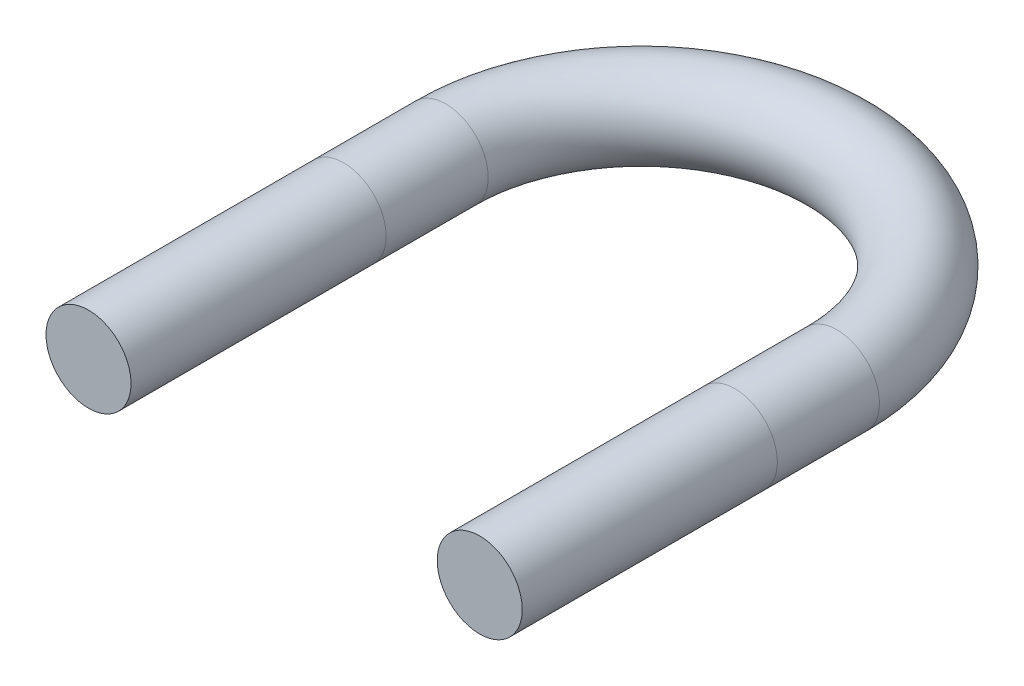
ISO-10303-21;
HEADER;
FILE_DESCRIPTION(('STEP AP214'),'2;1');
FILE_NAME('part.step','',(''),(''),'','','');
FILE_SCHEMA(('AUTOMOTIVE_DESIGN { 1 0 10303 214 1 1 1 1 }'));
ENDSEC;
DATA;
#1=APPLICATION_CONTEXT('core data for automotive mechanical design processes');
#2=APPLICATION_PROTOCOL_DEFINITION('international standard','automotive_design',2000,#1);
#3=PRODUCT_CONTEXT('',#1,'mechanical');
#4=PRODUCT('Part','Part','',(#3));
#5=PRODUCT_RELATED_PRODUCT_CATEGORY('part','',(#4));
#6=PRODUCT_DEFINITION_FORMATION('','',#4);
#7=PRODUCT_DEFINITION_CONTEXT('part definition',#1,'design');
#8=PRODUCT_DEFINITION('design','',#6,#7);
#9=PRODUCT_DEFINITION_SHAPE('','',#8);
#10=(LENGTH_UNIT() NAMED_UNIT(*) SI_UNIT(.MILLI.,.METRE.));
#11=(NAMED_UNIT(*) PLANE_ANGLE_UNIT() SI_UNIT($,.RADIAN.));
#12=(NAMED_UNIT(*) SI_UNIT($,.STERADIAN.) SOLID_ANGLE_UNIT());
#13=UNCERTAINTY_MEASURE_WITH_UNIT(LENGTH_MEASURE(1.E-05),#10,'distance_accuracy_value','');
#14=(GEOMETRIC_REPRESENTATION_CONTEXT(3) GLOBAL_UNCERTAINTY_ASSIGNED_CONTEXT((#13)) GLOBAL_UNIT_ASSIGNED_CONTEXT((#10,
#11,#12)) REPRESENTATION_CONTEXT('',''));
#15=CARTESIAN_POINT('',(0.,0.,0.));
#16=DIRECTION('',(0.,0.,1.));
#17=DIRECTION('',(1.,0.,0.));
#18=AXIS2_PLACEMENT_3D('',#15,#16,#17);
#19=CARTESIAN_POINT('',(23.,0.,0.));
#20=DIRECTION('',(0.,0.,1.));
#21=DIRECTION('',(1.,0.,0.));
#22=AXIS2_PLACEMENT_3D('',#19,#20,#21);
#23=CYLINDRICAL_SURFACE('',#22,5.);
#24=CARTESIAN_POINT('',(23.,0.,0.));
#25=DIRECTION('',(0.,0.,1.));
#26=DIRECTION('',(1.,0.,0.));
#27=AXIS2_PLACEMENT_3D('',#24,#25,#26);
#28=CIRCLE('',#27,5.);
#29=CARTESIAN_POINT('',(28.,0.,0.));
#30=VERTEX_POINT('',#29);
#31=EDGE_CURVE('E79',#30,#30,#28,.T.);
#32=ORIENTED_EDGE('',*,*,#31,.T.);
#33=EDGE_LOOP('',(#32));
#34=FACE_BOUND('',#33,.T.);
#35=CARTESIAN_POINT('',(23.,0.,12.));
#36=DIRECTION('',(0.,0.,1.));
#37=DIRECTION('',(1.,0.,0.));
#38=AXIS2_PLACEMENT_3D('',#35,#36,#37);
#39=CIRCLE('',#38,5.);
#40=CARTESIAN_POINT('',(28.,0.,12.));
#41=VERTEX_POINT('',#40);
#42=EDGE_CURVE('E11',#41,#41,#39,.F.);
#43=ORIENTED_EDGE('',*,*,#42,.T.);
#44=EDGE_LOOP('',(#43));
#45=FACE_BOUND('',#44,.T.);
#46=ADVANCED_FACE('F60',(#34,#45),#23,.T.);
#47=CARTESIAN_POINT('',(-23.,0.,42.));
#48=DIRECTION('',(0.,0.,-1.));
#49=DIRECTION('',(-1.,0.,0.));
#50=AXIS2_PLACEMENT_3D('',#47,#48,#49);
#51=CYLINDRICAL_SURFACE('',#50,5.);
#52=CARTESIAN_POINT('',(-23.,0.,0.));
#53=DIRECTION('',(0.,0.,-1.));
#54=DIRECTION('',(-1.,0.,0.));
#55=AXIS2_PLACEMENT_3D('',#52,#53,#54);
#56=CIRCLE('',#55,5.);
#57=CARTESIAN_POINT('',(-28.,0.,0.));
#58=VERTEX_POINT('',#57);
#59=EDGE_CURVE('E82',#58,#58,#56,.T.);
#60=ORIENTED_EDGE('',*,*,#59,.F.);
#61=EDGE_LOOP('',(#60));
#62=FACE_BOUND('',#61,.T.);
#63=CARTESIAN_POINT('',(-23.,0.,12.));
#64=DIRECTION('',(0.,0.,1.));
#65=DIRECTION('',(1.,0.,0.));
#66=AXIS2_PLACEMENT_3D('',#63,#64,#65);
#67=CIRCLE('',#66,5.);
#68=CARTESIAN_POINT('',(-18.,0.,12.));
#69=VERTEX_POINT('',#68);
#70=EDGE_CURVE('E64',#69,#69,#67,.F.);
#71=ORIENTED_EDGE('',*,*,#70,.T.);
#72=EDGE_LOOP('',(#71));
#73=FACE_BOUND('',#72,.T.);
#74=ADVANCED_FACE('F93',(#62,#73),#51,.T.);
#75=CARTESIAN_POINT('',(-23.,0.,42.));
#76=DIRECTION('',(0.,0.,-1.));
#77=DIRECTION('',(-1.,0.,0.));
#78=AXIS2_PLACEMENT_3D('',#75,#76,#77);
#79=PLANE('',#78);
#80=CARTESIAN_POINT('',(-23.,0.,42.));
#81=DIRECTION('',(0.,0.,-1.));
#82=DIRECTION('',(-1.,0.,0.));
#83=AXIS2_PLACEMENT_3D('',#80,#81,#82);
#84=CIRCLE('',#83,5.);
#85=CARTESIAN_POINT('',(-28.,0.,42.));
#86=VERTEX_POINT('',#85);
#87=EDGE_CURVE('E85',#86,#86,#84,.T.);
#88=ORIENTED_EDGE('',*,*,#87,.F.);
#89=EDGE_LOOP('',(#88));
#90=FACE_BOUND('',#89,.T.);
#91=ADVANCED_FACE('F62',(#90),#79,.F.);
#92=CARTESIAN_POINT('',(23.,0.,42.));
#93=DIRECTION('',(0.,0.,1.));
#94=DIRECTION('',(1.,0.,0.));
#95=AXIS2_PLACEMENT_3D('',#92,#93,#94);
#96=PLANE('',#95);
#97=CARTESIAN_POINT('',(23.,0.,42.));
#98=DIRECTION('',(0.,0.,1.));
#99=DIRECTION('',(1.,0.,0.));
#100=AXIS2_PLACEMENT_3D('',#97,#98,#99);
#101=CIRCLE('',#100,5.);
#102=CARTESIAN_POINT('',(28.,0.,42.));
#103=VERTEX_POINT('',#102);
#104=EDGE_CURVE('E75',#103,#103,#101,.T.);
#105=ORIENTED_EDGE('',*,*,#104,.T.);
#106=EDGE_LOOP('',(#105));
#107=FACE_BOUND('',#106,.T.);
#108=ADVANCED_FACE('F92',(#107),#96,.T.);
#109=ORIENTED_EDGE('',*,*,#70,.F.);
#110=EDGE_LOOP('',(#109));
#111=FACE_BOUND('',#110,.T.);
#112=ORIENTED_EDGE('',*,*,#87,.T.);
#113=EDGE_LOOP('',(#112));
#114=FACE_BOUND('',#113,.T.);
#115=ADVANCED_FACE('F89',(#111,#114),#51,.T.);
#116=CARTESIAN_POINT('',(0.,0.,0.));
#117=DIRECTION('',(0.,-1.,0.));
#118=DIRECTION('',(0.,0.,-1.));
#119=AXIS2_PLACEMENT_3D('',#116,#117,#118);
#120=TOROIDAL_SURFACE('',#119,23.,5.);
#121=CARTESIAN_POINT('',(0.,0.,0.));
#122=DIRECTION('',(0.,-1.,0.));
#123=DIRECTION('',(0.,0.,-1.));
#124=AXIS2_PLACEMENT_3D('',#121,#122,#123);
#125=CIRCLE('',#124,28.);
#126=EDGE_CURVE('',#58,#30,#125,.T.);
#127=ORIENTED_EDGE('',*,*,#59,.T.);
#128=ORIENTED_EDGE('',*,*,#31,.F.);
#129=ORIENTED_EDGE('',*,*,#126,.T.);
#130=ORIENTED_EDGE('',*,*,#126,.F.);
#131=EDGE_LOOP('',(#127,#129,#128,#130));
#132=FACE_BOUND('',#131,.T.);
#133=ADVANCED_FACE('F113',(#132),#120,.T.);
#134=ORIENTED_EDGE('',*,*,#42,.F.);
#135=EDGE_LOOP('',(#134));
#136=FACE_BOUND('',#135,.T.);
#137=ORIENTED_EDGE('',*,*,#104,.F.);
#138=EDGE_LOOP('',(#137));
#139=FACE_BOUND('',#138,.T.);
#140=ADVANCED_FACE('F103',(#136,#139),#23,.T.);
#141=CLOSED_SHELL('',(#46,#74,#91,#108,#115,#133,#140));
#142=MANIFOLD_SOLID_BREP('B2',#141);
#143=ADVANCED_BREP_SHAPE_REPRESENTATION('',(#18,#142),#14);
#144=SHAPE_DEFINITION_REPRESENTATION(#9,#143);
ENDSEC;
END-ISO-10303-21;
